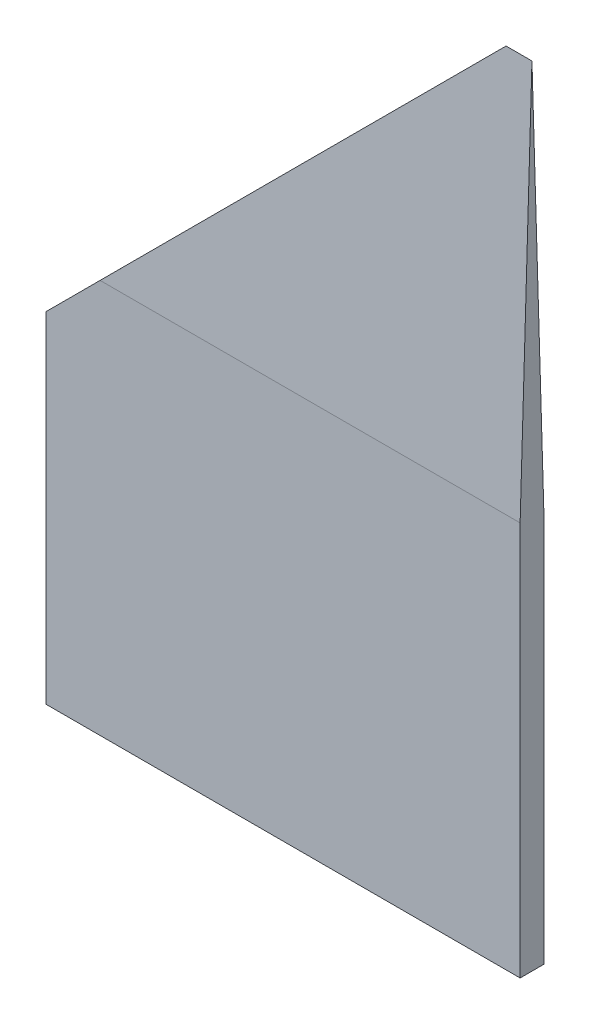
ISO-10303-21;
HEADER;
FILE_DESCRIPTION(('STEP AP214'),'2;1');
FILE_NAME('part.step','',(''),(''),'','','');
FILE_SCHEMA(('AUTOMOTIVE_DESIGN { 1 0 10303 214 1 1 1 1 }'));
ENDSEC;
DATA;
#1=APPLICATION_CONTEXT('core data for automotive mechanical design processes');
#2=APPLICATION_PROTOCOL_DEFINITION('international standard','automotive_design',2000,#1);
#3=PRODUCT_CONTEXT('',#1,'mechanical');
#4=PRODUCT('Part','Part','',(#3));
#5=PRODUCT_RELATED_PRODUCT_CATEGORY('part','',(#4));
#6=PRODUCT_DEFINITION_FORMATION('','',#4);
#7=PRODUCT_DEFINITION_CONTEXT('part definition',#1,'design');
#8=PRODUCT_DEFINITION('design','',#6,#7);
#9=PRODUCT_DEFINITION_SHAPE('','',#8);
#10=(LENGTH_UNIT() NAMED_UNIT(*) SI_UNIT(.MILLI.,.METRE.));
#11=(NAMED_UNIT(*) PLANE_ANGLE_UNIT() SI_UNIT($,.RADIAN.));
#12=(NAMED_UNIT(*) SI_UNIT($,.STERADIAN.) SOLID_ANGLE_UNIT());
#13=UNCERTAINTY_MEASURE_WITH_UNIT(LENGTH_MEASURE(1.E-05),#10,'distance_accuracy_value','');
#14=(GEOMETRIC_REPRESENTATION_CONTEXT(3) GLOBAL_UNCERTAINTY_ASSIGNED_CONTEXT((#13)) GLOBAL_UNIT_ASSIGNED_CONTEXT((#10,
#11,#12)) REPRESENTATION_CONTEXT('',''));
#15=CARTESIAN_POINT('',(0.,0.,0.));
#16=DIRECTION('',(0.,0.,1.));
#17=DIRECTION('',(1.,0.,0.));
#18=AXIS2_PLACEMENT_3D('',#15,#16,#17);
#19=CARTESIAN_POINT('',(-27.5,0.,1.27));
#20=DIRECTION('',(-1.,0.,0.));
#21=DIRECTION('',(0.,0.,1.));
#22=AXIS2_PLACEMENT_3D('',#19,#20,#21);
#23=PLANE('',#22);
#24=DIRECTION('',(0.,1.,0.));
#25=VECTOR('',#24,1.);
#26=CARTESIAN_POINT('',(-27.5,0.,-1.27));
#27=LINE('',#26,#25);
#28=CARTESIAN_POINT('',(-27.5,0.,-1.27));
#29=VERTEX_POINT('',#28);
#30=CARTESIAN_POINT('',(-27.5,42.3150316829446,-1.27));
#31=VERTEX_POINT('',#30);
#32=EDGE_CURVE('E128',#29,#31,#27,.T.);
#33=ORIENTED_EDGE('',*,*,#32,.T.);
#34=DIRECTION('',(0.,0.999549914704946,0.0299994668841743));
#35=VECTOR('',#34,1.);
#36=CARTESIAN_POINT('',(-27.5,0.11424652499368,-2.53657112186919));
#37=LINE('',#36,#35);
#38=CARTESIAN_POINT('',(-27.5,84.6300633658892,0.));
#39=VERTEX_POINT('',#38);
#40=EDGE_CURVE('E60',#31,#39,#37,.T.);
#41=ORIENTED_EDGE('',*,*,#40,.T.);
#42=DIRECTION('',(0.,-0.999549914704946,0.0299994668841743));
#43=VECTOR('',#42,1.);
#44=CARTESIAN_POINT('',(-27.5,0.0380821749978932,2.53885704062306));
#45=LINE('',#44,#43);
#46=CARTESIAN_POINT('',(-27.5,42.3150316829446,1.27));
#47=VERTEX_POINT('',#46);
#48=EDGE_CURVE('E133',#39,#47,#45,.T.);
#49=ORIENTED_EDGE('',*,*,#48,.T.);
#50=DIRECTION('',(0.,1.,0.));
#51=VECTOR('',#50,1.);
#52=CARTESIAN_POINT('',(-27.5,0.,1.27));
#53=LINE('',#52,#51);
#54=CARTESIAN_POINT('',(-27.5,0.,1.27));
#55=VERTEX_POINT('',#54);
#56=EDGE_CURVE('E139',#55,#47,#53,.T.);
#57=ORIENTED_EDGE('',*,*,#56,.F.);
#58=DIRECTION('',(0.,0.,-1.));
#59=VECTOR('',#58,1.);
#60=CARTESIAN_POINT('',(-27.5,0.,1.27));
#61=LINE('',#60,#59);
#62=EDGE_CURVE('E140',#55,#29,#61,.T.);
#63=ORIENTED_EDGE('',*,*,#62,.T.);
#64=EDGE_LOOP('',(#33,#41,#49,#57,#63));
#65=FACE_BOUND('',#64,.T.);
#66=ADVANCED_FACE('F45',(#65),#23,.F.);
#67=CARTESIAN_POINT('',(-30.2798132914317,84.6300633658892,1.27));
#68=DIRECTION('',(0.707106781186548,-0.707106781186548,0.));
#69=DIRECTION('',(0.707106781186548,0.707106781186548,0.));
#70=AXIS2_PLACEMENT_3D('',#67,#68,#69);
#71=PLANE('',#70);
#72=DIRECTION('',(0.706947598276057,0.706947598276057,-0.0212176007934425));
#73=VECTOR('',#72,1.);
#74=CARTESIAN_POINT('',(-30.2988629509728,84.6110137063482,0.000571736960956011));
#75=LINE('',#74,#73);
#76=CARTESIAN_POINT('',(-72.5948449743763,42.3150316829446,1.27));
#77=VERTEX_POINT('',#76);
#78=CARTESIAN_POINT('',(-30.2798132914317,84.6300633658892,0.));
#79=VERTEX_POINT('',#78);
#80=EDGE_CURVE('E120',#77,#79,#75,.T.);
#81=ORIENTED_EDGE('',*,*,#80,.T.);
#82=DIRECTION('',(-0.706947598276057,-0.706947598276057,-0.0212176007934425));
#83=VECTOR('',#82,1.);
#84=CARTESIAN_POINT('',(-30.2607636318907,84.6491130254303,0.000571736960956011));
#85=LINE('',#84,#83);
#86=CARTESIAN_POINT('',(-72.5948449743763,42.3150316829446,-1.27));
#87=VERTEX_POINT('',#86);
#88=EDGE_CURVE('E107',#79,#87,#85,.T.);
#89=ORIENTED_EDGE('',*,*,#88,.T.);
#90=DIRECTION('',(-0.707106781186548,-0.707106781186548,0.));
#91=VECTOR('',#90,1.);
#92=CARTESIAN_POINT('',(-30.2798132914317,84.6300633658892,-1.27));
#93=LINE('',#92,#91);
#94=CARTESIAN_POINT('',(-78.3798132914317,36.5300633658892,-1.27));
#95=VERTEX_POINT('',#94);
#96=EDGE_CURVE('E118',#87,#95,#93,.T.);
#97=ORIENTED_EDGE('',*,*,#96,.T.);
#98=DIRECTION('',(0.,0.,-1.));
#99=VECTOR('',#98,1.);
#100=CARTESIAN_POINT('',(-78.3798132914317,36.5300633658892,1.27));
#101=LINE('',#100,#99);
#102=CARTESIAN_POINT('',(-78.3798132914317,36.5300633658892,1.27));
#103=VERTEX_POINT('',#102);
#104=EDGE_CURVE('E114',#103,#95,#101,.T.);
#105=ORIENTED_EDGE('',*,*,#104,.F.);
#106=DIRECTION('',(-0.707106781186548,-0.707106781186548,0.));
#107=VECTOR('',#106,1.);
#108=CARTESIAN_POINT('',(-30.2798132914317,84.6300633658892,1.27));
#109=LINE('',#108,#107);
#110=EDGE_CURVE('E91',#77,#103,#109,.T.);
#111=ORIENTED_EDGE('',*,*,#110,.F.);
#112=EDGE_LOOP('',(#81,#89,#97,#105,#111));
#113=FACE_BOUND('',#112,.T.);
#114=ADVANCED_FACE('F117',(#113),#71,.F.);
#115=CARTESIAN_POINT('',(-78.3798132914317,0.,1.27));
#116=DIRECTION('',(1.,0.,0.));
#117=DIRECTION('',(0.,0.,-1.));
#118=AXIS2_PLACEMENT_3D('',#115,#116,#117);
#119=PLANE('',#118);
#120=DIRECTION('',(0.,-1.,0.));
#121=VECTOR('',#120,1.);
#122=CARTESIAN_POINT('',(-78.3798132914317,0.,-1.27));
#123=LINE('',#122,#121);
#124=CARTESIAN_POINT('',(-78.3798132914317,0.,-1.27));
#125=VERTEX_POINT('',#124);
#126=EDGE_CURVE('E126',#95,#125,#123,.T.);
#127=ORIENTED_EDGE('',*,*,#126,.T.);
#128=DIRECTION('',(0.,0.,-1.));
#129=VECTOR('',#128,1.);
#130=CARTESIAN_POINT('',(-78.3798132914317,0.,1.27));
#131=LINE('',#130,#129);
#132=CARTESIAN_POINT('',(-78.3798132914317,0.,1.27));
#133=VERTEX_POINT('',#132);
#134=EDGE_CURVE('E143',#133,#125,#131,.T.);
#135=ORIENTED_EDGE('',*,*,#134,.F.);
#136=DIRECTION('',(0.,-1.,0.));
#137=VECTOR('',#136,1.);
#138=CARTESIAN_POINT('',(-78.3798132914317,0.,1.27));
#139=LINE('',#138,#137);
#140=EDGE_CURVE('E151',#103,#133,#139,.T.);
#141=ORIENTED_EDGE('',*,*,#140,.F.);
#142=ORIENTED_EDGE('',*,*,#104,.T.);
#143=EDGE_LOOP('',(#127,#135,#141,#142));
#144=FACE_BOUND('',#143,.T.);
#145=ADVANCED_FACE('F149',(#144),#119,.F.);
#146=CARTESIAN_POINT('',(-27.5,0.,1.27));
#147=DIRECTION('',(0.,1.,0.));
#148=DIRECTION('',(0.,0.,1.));
#149=AXIS2_PLACEMENT_3D('',#146,#147,#148);
#150=PLANE('',#149);
#151=DIRECTION('',(1.,0.,0.));
#152=VECTOR('',#151,1.);
#153=CARTESIAN_POINT('',(-27.5,0.,-1.27));
#154=LINE('',#153,#152);
#155=EDGE_CURVE('E86',#125,#29,#154,.T.);
#156=ORIENTED_EDGE('',*,*,#155,.T.);
#157=ORIENTED_EDGE('',*,*,#62,.F.);
#158=DIRECTION('',(1.,0.,0.));
#159=VECTOR('',#158,1.);
#160=CARTESIAN_POINT('',(-27.5,0.,1.27));
#161=LINE('',#160,#159);
#162=EDGE_CURVE('E69',#133,#55,#161,.T.);
#163=ORIENTED_EDGE('',*,*,#162,.F.);
#164=ORIENTED_EDGE('',*,*,#134,.T.);
#165=EDGE_LOOP('',(#156,#157,#163,#164));
#166=FACE_BOUND('',#165,.T.);
#167=ADVANCED_FACE('F171',(#166),#150,.F.);
#168=CARTESIAN_POINT('',(0.,0.,1.27));
#169=DIRECTION('',(0.,0.,1.));
#170=DIRECTION('',(1.,0.,0.));
#171=AXIS2_PLACEMENT_3D('',#168,#169,#170);
#172=PLANE('',#171);
#173=DIRECTION('',(1.,0.,0.));
#174=VECTOR('',#173,1.);
#175=CARTESIAN_POINT('',(0.,42.3150316829446,1.27));
#176=LINE('',#175,#174);
#177=EDGE_CURVE('E11',#77,#47,#176,.T.);
#178=ORIENTED_EDGE('',*,*,#177,.F.);
#179=ORIENTED_EDGE('',*,*,#110,.T.);
#180=ORIENTED_EDGE('',*,*,#140,.T.);
#181=ORIENTED_EDGE('',*,*,#162,.T.);
#182=ORIENTED_EDGE('',*,*,#56,.T.);
#183=EDGE_LOOP('',(#178,#179,#180,#181,#182));
#184=FACE_BOUND('',#183,.T.);
#185=ADVANCED_FACE('F173',(#184),#172,.T.);
#186=CARTESIAN_POINT('',(0.,0.,-1.27));
#187=DIRECTION('',(0.,0.,1.));
#188=DIRECTION('',(1.,0.,0.));
#189=AXIS2_PLACEMENT_3D('',#186,#187,#188);
#190=PLANE('',#189);
#191=ORIENTED_EDGE('',*,*,#96,.F.);
#192=DIRECTION('',(1.,0.,0.));
#193=VECTOR('',#192,1.);
#194=CARTESIAN_POINT('',(0.,42.3150316829446,-1.27));
#195=LINE('',#194,#193);
#196=EDGE_CURVE('E53',#87,#31,#195,.T.);
#197=ORIENTED_EDGE('',*,*,#196,.T.);
#198=ORIENTED_EDGE('',*,*,#32,.F.);
#199=ORIENTED_EDGE('',*,*,#155,.F.);
#200=ORIENTED_EDGE('',*,*,#126,.F.);
#201=EDGE_LOOP('',(#191,#197,#198,#199,#200));
#202=FACE_BOUND('',#201,.T.);
#203=ADVANCED_FACE('F125',(#202),#190,.F.);
#204=CARTESIAN_POINT('',(-100.076,84.6300633658892,0.));
#205=DIRECTION('',(0.,-0.0299994668841743,-0.999549914704946));
#206=DIRECTION('',(0.,0.999549914704946,-0.0299994668841743));
#207=AXIS2_PLACEMENT_3D('',#204,#205,#206);
#208=PLANE('',#207);
#209=DIRECTION('',(1.,0.,0.));
#210=VECTOR('',#209,1.);
#211=CARTESIAN_POINT('',(-100.076,84.6300633658892,0.));
#212=LINE('',#211,#210);
#213=EDGE_CURVE('E122',#79,#39,#212,.T.);
#214=ORIENTED_EDGE('',*,*,#213,.F.);
#215=ORIENTED_EDGE('',*,*,#80,.F.);
#216=ORIENTED_EDGE('',*,*,#177,.T.);
#217=ORIENTED_EDGE('',*,*,#48,.F.);
#218=EDGE_LOOP('',(#214,#215,#216,#217));
#219=FACE_BOUND('',#218,.T.);
#220=ADVANCED_FACE('F201',(#219),#208,.F.);
#221=CARTESIAN_POINT('',(-100.076,42.3150316829446,-1.27));
#222=DIRECTION('',(0.,-0.0299994668841743,0.999549914704946));
#223=DIRECTION('',(0.,-0.999549914704946,-0.0299994668841743));
#224=AXIS2_PLACEMENT_3D('',#221,#222,#223);
#225=PLANE('',#224);
#226=ORIENTED_EDGE('',*,*,#196,.F.);
#227=ORIENTED_EDGE('',*,*,#88,.F.);
#228=ORIENTED_EDGE('',*,*,#213,.T.);
#229=ORIENTED_EDGE('',*,*,#40,.F.);
#230=EDGE_LOOP('',(#226,#227,#228,#229));
#231=FACE_BOUND('',#230,.T.);
#232=ADVANCED_FACE('F106',(#231),#225,.F.);
#233=CLOSED_SHELL('',(#66,#114,#145,#167,#185,#203,#220,#232));
#234=MANIFOLD_SOLID_BREP('B2',#233);
#235=ADVANCED_BREP_SHAPE_REPRESENTATION('',(#18,#234),#14);
#236=SHAPE_DEFINITION_REPRESENTATION(#9,#235);
ENDSEC;
END-ISO-10303-21;
